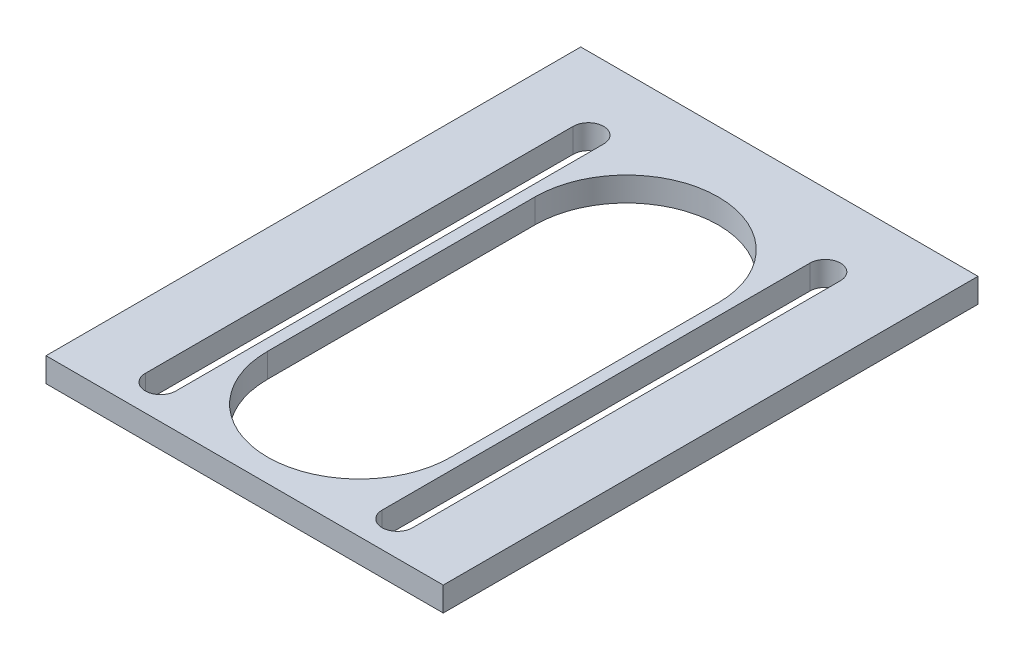
ISO-10303-21;
HEADER;
FILE_DESCRIPTION(('STEP AP214'),'2;1');
FILE_NAME('part.step','',(''),(''),'','','');
FILE_SCHEMA(('AUTOMOTIVE_DESIGN { 1 0 10303 214 1 1 1 1 }'));
ENDSEC;
DATA;
#1=APPLICATION_CONTEXT('core data for automotive mechanical design processes');
#2=APPLICATION_PROTOCOL_DEFINITION('international standard','automotive_design',2000,#1);
#3=PRODUCT_CONTEXT('',#1,'mechanical');
#4=PRODUCT('Part','Part','',(#3));
#5=PRODUCT_RELATED_PRODUCT_CATEGORY('part','',(#4));
#6=PRODUCT_DEFINITION_FORMATION('','',#4);
#7=PRODUCT_DEFINITION_CONTEXT('part definition',#1,'design');
#8=PRODUCT_DEFINITION('design','',#6,#7);
#9=PRODUCT_DEFINITION_SHAPE('','',#8);
#10=(LENGTH_UNIT() NAMED_UNIT(*) SI_UNIT(.MILLI.,.METRE.));
#11=(NAMED_UNIT(*) PLANE_ANGLE_UNIT() SI_UNIT($,.RADIAN.));
#12=(NAMED_UNIT(*) SI_UNIT($,.STERADIAN.) SOLID_ANGLE_UNIT());
#13=UNCERTAINTY_MEASURE_WITH_UNIT(LENGTH_MEASURE(1.E-05),#10,'distance_accuracy_value','');
#14=(GEOMETRIC_REPRESENTATION_CONTEXT(3) GLOBAL_UNCERTAINTY_ASSIGNED_CONTEXT((#13)) GLOBAL_UNIT_ASSIGNED_CONTEXT((#10,
#11,#12)) REPRESENTATION_CONTEXT('',''));
#15=CARTESIAN_POINT('',(0.,0.,0.));
#16=DIRECTION('',(0.,0.,1.));
#17=DIRECTION('',(1.,0.,0.));
#18=AXIS2_PLACEMENT_3D('',#15,#16,#17);
#19=CARTESIAN_POINT('',(0.,3.175,0.));
#20=DIRECTION('',(0.,1.,0.));
#21=DIRECTION('',(0.,0.,1.));
#22=AXIS2_PLACEMENT_3D('',#19,#20,#21);
#23=PLANE('',#22);
#24=DIRECTION('',(0.,0.,-1.));
#25=VECTOR('',#24,1.);
#26=CARTESIAN_POINT('',(26.,3.175,33.4551165878642));
#27=LINE('',#26,#25);
#28=CARTESIAN_POINT('',(26.,3.175,33.4551165878642));
#29=VERTEX_POINT('',#28);
#30=CARTESIAN_POINT('',(26.,3.175,-36.5448834121358));
#31=VERTEX_POINT('',#30);
#32=EDGE_CURVE('E315',#29,#31,#27,.T.);
#33=ORIENTED_EDGE('',*,*,#32,.T.);
#34=DIRECTION('',(-1.,0.,0.));
#35=VECTOR('',#34,1.);
#36=CARTESIAN_POINT('',(26.,3.175,-36.5448834121358));
#37=LINE('',#36,#35);
#38=CARTESIAN_POINT('',(-26.,3.175,-36.5448834121358));
#39=VERTEX_POINT('',#38);
#40=EDGE_CURVE('E318',#31,#39,#37,.T.);
#41=ORIENTED_EDGE('',*,*,#40,.T.);
#42=DIRECTION('',(0.,0.,1.));
#43=VECTOR('',#42,1.);
#44=CARTESIAN_POINT('',(-26.,3.175,-36.5448834121358));
#45=LINE('',#44,#43);
#46=CARTESIAN_POINT('',(-26.,3.175,33.4551165878642));
#47=VERTEX_POINT('',#46);
#48=EDGE_CURVE('E321',#39,#47,#45,.T.);
#49=ORIENTED_EDGE('',*,*,#48,.T.);
#50=DIRECTION('',(1.,0.,0.));
#51=VECTOR('',#50,1.);
#52=CARTESIAN_POINT('',(-26.,3.175,33.4551165878642));
#53=LINE('',#52,#51);
#54=EDGE_CURVE('E323',#47,#29,#53,.T.);
#55=ORIENTED_EDGE('',*,*,#54,.T.);
#56=EDGE_LOOP('',(#33,#41,#49,#55));
#57=FACE_BOUND('',#56,.T.);
#58=CARTESIAN_POINT('',(-15.5,3.175,28.9551165878641));
#59=DIRECTION('',(0.,1.,0.));
#60=DIRECTION('',(0.,0.,1.));
#61=AXIS2_PLACEMENT_3D('',#58,#59,#60);
#62=CIRCLE('',#61,2.);
#63=CARTESIAN_POINT('',(-17.5,3.175,28.9551165878641));
#64=VERTEX_POINT('',#63);
#65=CARTESIAN_POINT('',(-13.5,3.175,28.9551165878641));
#66=VERTEX_POINT('',#65);
#67=EDGE_CURVE('E286',#64,#66,#62,.T.);
#68=ORIENTED_EDGE('',*,*,#67,.F.);
#69=DIRECTION('',(0.,0.,1.));
#70=VECTOR('',#69,1.);
#71=CARTESIAN_POINT('',(-17.5,3.175,0.));
#72=LINE('',#71,#70);
#73=CARTESIAN_POINT('',(-17.5,3.175,-27.0448834121359));
#74=VERTEX_POINT('',#73);
#75=EDGE_CURVE('E284',#74,#64,#72,.T.);
#76=ORIENTED_EDGE('',*,*,#75,.F.);
#77=CARTESIAN_POINT('',(-15.5,3.175,-27.0448834121359));
#78=DIRECTION('',(0.,1.,0.));
#79=DIRECTION('',(0.,0.,1.));
#80=AXIS2_PLACEMENT_3D('',#77,#78,#79);
#81=CIRCLE('',#80,2.);
#82=CARTESIAN_POINT('',(-13.5,3.175,-27.0448834121359));
#83=VERTEX_POINT('',#82);
#84=EDGE_CURVE('E292',#83,#74,#81,.T.);
#85=ORIENTED_EDGE('',*,*,#84,.F.);
#86=DIRECTION('',(0.,0.,1.));
#87=VECTOR('',#86,1.);
#88=CARTESIAN_POINT('',(-13.5,3.175,0.));
#89=LINE('',#88,#87);
#90=EDGE_CURVE('E289',#83,#66,#89,.T.);
#91=ORIENTED_EDGE('',*,*,#90,.T.);
#92=EDGE_LOOP('',(#68,#76,#85,#91));
#93=FACE_BOUND('',#92,.T.);
#94=CARTESIAN_POINT('',(0.,3.175,18.4551165878641));
#95=DIRECTION('',(0.,1.,0.));
#96=DIRECTION('',(0.,0.,1.));
#97=AXIS2_PLACEMENT_3D('',#94,#95,#96);
#98=CIRCLE('',#97,12.);
#99=CARTESIAN_POINT('',(-12.,3.175,18.4551165878641));
#100=VERTEX_POINT('',#99);
#101=CARTESIAN_POINT('',(12.,3.175,18.4551165878641));
#102=VERTEX_POINT('',#101);
#103=EDGE_CURVE('E255',#100,#102,#98,.T.);
#104=ORIENTED_EDGE('',*,*,#103,.F.);
#105=DIRECTION('',(0.,0.,1.));
#106=VECTOR('',#105,1.);
#107=CARTESIAN_POINT('',(-12.,3.175,0.));
#108=LINE('',#107,#106);
#109=CARTESIAN_POINT('',(-12.,3.175,-16.5448834121359));
#110=VERTEX_POINT('',#109);
#111=EDGE_CURVE('E253',#110,#100,#108,.T.);
#112=ORIENTED_EDGE('',*,*,#111,.F.);
#113=CARTESIAN_POINT('',(0.,3.175,-16.5448834121359));
#114=DIRECTION('',(0.,1.,0.));
#115=DIRECTION('',(0.,0.,1.));
#116=AXIS2_PLACEMENT_3D('',#113,#114,#115);
#117=CIRCLE('',#116,12.);
#118=CARTESIAN_POINT('',(12.,3.175,-16.5448834121359));
#119=VERTEX_POINT('',#118);
#120=EDGE_CURVE('E261',#119,#110,#117,.T.);
#121=ORIENTED_EDGE('',*,*,#120,.F.);
#122=DIRECTION('',(0.,0.,1.));
#123=VECTOR('',#122,1.);
#124=CARTESIAN_POINT('',(12.,3.175,0.));
#125=LINE('',#124,#123);
#126=EDGE_CURVE('E258',#119,#102,#125,.T.);
#127=ORIENTED_EDGE('',*,*,#126,.T.);
#128=EDGE_LOOP('',(#104,#112,#121,#127));
#129=FACE_BOUND('',#128,.T.);
#130=CARTESIAN_POINT('',(15.5,3.175,28.9551165878641));
#131=DIRECTION('',(0.,1.,0.));
#132=DIRECTION('',(0.,0.,1.));
#133=AXIS2_PLACEMENT_3D('',#130,#131,#132);
#134=CIRCLE('',#133,1.99999999999997);
#135=CARTESIAN_POINT('',(13.5,3.175,28.9551165878641));
#136=VERTEX_POINT('',#135);
#137=CARTESIAN_POINT('',(17.5,3.175,28.9551165878641));
#138=VERTEX_POINT('',#137);
#139=EDGE_CURVE('E227',#136,#138,#134,.T.);
#140=ORIENTED_EDGE('',*,*,#139,.F.);
#141=DIRECTION('',(0.,0.,1.));
#142=VECTOR('',#141,1.);
#143=CARTESIAN_POINT('',(13.5,3.175,0.));
#144=LINE('',#143,#142);
#145=CARTESIAN_POINT('',(13.5,3.175,-27.0448834121359));
#146=VERTEX_POINT('',#145);
#147=EDGE_CURVE('E219',#146,#136,#144,.T.);
#148=ORIENTED_EDGE('',*,*,#147,.F.);
#149=CARTESIAN_POINT('',(15.5,3.175,-27.0448834121359));
#150=DIRECTION('',(0.,1.,0.));
#151=DIRECTION('',(0.,0.,1.));
#152=AXIS2_PLACEMENT_3D('',#149,#150,#151);
#153=CIRCLE('',#152,1.99999999999997);
#154=CARTESIAN_POINT('',(17.5,3.175,-27.0448834121359));
#155=VERTEX_POINT('',#154);
#156=EDGE_CURVE('E238',#155,#146,#153,.T.);
#157=ORIENTED_EDGE('',*,*,#156,.F.);
#158=DIRECTION('',(0.,0.,1.));
#159=VECTOR('',#158,1.);
#160=CARTESIAN_POINT('',(17.5,3.175,0.));
#161=LINE('',#160,#159);
#162=EDGE_CURVE('E120',#155,#138,#161,.T.);
#163=ORIENTED_EDGE('',*,*,#162,.T.);
#164=EDGE_LOOP('',(#140,#148,#157,#163));
#165=FACE_BOUND('',#164,.T.);
#166=ADVANCED_FACE('F105',(#57,#93,#129,#165),#23,.T.);
#167=CARTESIAN_POINT('',(0.,0.,0.));
#168=DIRECTION('',(0.,1.,0.));
#169=DIRECTION('',(0.,0.,1.));
#170=AXIS2_PLACEMENT_3D('',#167,#168,#169);
#171=PLANE('',#170);
#172=DIRECTION('',(0.,0.,1.));
#173=VECTOR('',#172,1.);
#174=CARTESIAN_POINT('',(-12.,0.,0.));
#175=LINE('',#174,#173);
#176=CARTESIAN_POINT('',(-12.,0.,-16.5448834121359));
#177=VERTEX_POINT('',#176);
#178=CARTESIAN_POINT('',(-12.,0.,18.4551165878641));
#179=VERTEX_POINT('',#178);
#180=EDGE_CURVE('E234',#177,#179,#175,.T.);
#181=ORIENTED_EDGE('',*,*,#180,.T.);
#182=CARTESIAN_POINT('',(0.,0.,18.4551165878641));
#183=DIRECTION('',(0.,1.,0.));
#184=DIRECTION('',(0.,0.,1.));
#185=AXIS2_PLACEMENT_3D('',#182,#183,#184);
#186=CIRCLE('',#185,12.);
#187=CARTESIAN_POINT('',(12.,0.,18.4551165878641));
#188=VERTEX_POINT('',#187);
#189=EDGE_CURVE('E266',#179,#188,#186,.T.);
#190=ORIENTED_EDGE('',*,*,#189,.T.);
#191=DIRECTION('',(0.,0.,1.));
#192=VECTOR('',#191,1.);
#193=CARTESIAN_POINT('',(12.,0.,0.));
#194=LINE('',#193,#192);
#195=CARTESIAN_POINT('',(12.,0.,-16.5448834121359));
#196=VERTEX_POINT('',#195);
#197=EDGE_CURVE('E269',#196,#188,#194,.T.);
#198=ORIENTED_EDGE('',*,*,#197,.F.);
#199=CARTESIAN_POINT('',(0.,0.,-16.5448834121359));
#200=DIRECTION('',(0.,1.,0.));
#201=DIRECTION('',(0.,0.,1.));
#202=AXIS2_PLACEMENT_3D('',#199,#200,#201);
#203=CIRCLE('',#202,12.);
#204=EDGE_CURVE('E256',#196,#177,#203,.T.);
#205=ORIENTED_EDGE('',*,*,#204,.T.);
#206=EDGE_LOOP('',(#181,#190,#198,#205));
#207=FACE_BOUND('',#206,.T.);
#208=DIRECTION('',(0.,0.,-1.));
#209=VECTOR('',#208,1.);
#210=CARTESIAN_POINT('',(26.,0.,33.4551165878642));
#211=LINE('',#210,#209);
#212=CARTESIAN_POINT('',(26.,0.,33.4551165878642));
#213=VERTEX_POINT('',#212);
#214=CARTESIAN_POINT('',(26.,0.,-36.5448834121358));
#215=VERTEX_POINT('',#214);
#216=EDGE_CURVE('E314',#213,#215,#211,.T.);
#217=ORIENTED_EDGE('',*,*,#216,.F.);
#218=DIRECTION('',(1.,0.,0.));
#219=VECTOR('',#218,1.);
#220=CARTESIAN_POINT('',(-26.,0.,33.4551165878642));
#221=LINE('',#220,#219);
#222=CARTESIAN_POINT('',(-26.,0.,33.4551165878642));
#223=VERTEX_POINT('',#222);
#224=EDGE_CURVE('E319',#223,#213,#221,.T.);
#225=ORIENTED_EDGE('',*,*,#224,.F.);
#226=DIRECTION('',(0.,0.,1.));
#227=VECTOR('',#226,1.);
#228=CARTESIAN_POINT('',(-26.,0.,-36.5448834121358));
#229=LINE('',#228,#227);
#230=CARTESIAN_POINT('',(-26.,0.,-36.5448834121358));
#231=VERTEX_POINT('',#230);
#232=EDGE_CURVE('E330',#231,#223,#229,.T.);
#233=ORIENTED_EDGE('',*,*,#232,.F.);
#234=DIRECTION('',(-1.,0.,0.));
#235=VECTOR('',#234,1.);
#236=CARTESIAN_POINT('',(26.,0.,-36.5448834121358));
#237=LINE('',#236,#235);
#238=EDGE_CURVE('E328',#215,#231,#237,.T.);
#239=ORIENTED_EDGE('',*,*,#238,.F.);
#240=EDGE_LOOP('',(#217,#225,#233,#239));
#241=FACE_BOUND('',#240,.T.);
#242=DIRECTION('',(0.,0.,1.));
#243=VECTOR('',#242,1.);
#244=CARTESIAN_POINT('',(-17.5,0.,0.));
#245=LINE('',#244,#243);
#246=CARTESIAN_POINT('',(-17.5,0.,-27.0448834121359));
#247=VERTEX_POINT('',#246);
#248=CARTESIAN_POINT('',(-17.5,0.,28.9551165878641));
#249=VERTEX_POINT('',#248);
#250=EDGE_CURVE('E283',#247,#249,#245,.T.);
#251=ORIENTED_EDGE('',*,*,#250,.T.);
#252=CARTESIAN_POINT('',(-15.5,0.,28.9551165878641));
#253=DIRECTION('',(0.,1.,0.));
#254=DIRECTION('',(0.,0.,1.));
#255=AXIS2_PLACEMENT_3D('',#252,#253,#254);
#256=CIRCLE('',#255,2.);
#257=CARTESIAN_POINT('',(-13.5,0.,28.9551165878641));
#258=VERTEX_POINT('',#257);
#259=EDGE_CURVE('E297',#249,#258,#256,.T.);
#260=ORIENTED_EDGE('',*,*,#259,.T.);
#261=DIRECTION('',(0.,0.,1.));
#262=VECTOR('',#261,1.);
#263=CARTESIAN_POINT('',(-13.5,0.,0.));
#264=LINE('',#263,#262);
#265=CARTESIAN_POINT('',(-13.5,0.,-27.0448834121359));
#266=VERTEX_POINT('',#265);
#267=EDGE_CURVE('E300',#266,#258,#264,.T.);
#268=ORIENTED_EDGE('',*,*,#267,.F.);
#269=CARTESIAN_POINT('',(-15.5,0.,-27.0448834121359));
#270=DIRECTION('',(0.,1.,0.));
#271=DIRECTION('',(0.,0.,1.));
#272=AXIS2_PLACEMENT_3D('',#269,#270,#271);
#273=CIRCLE('',#272,2.);
#274=EDGE_CURVE('E287',#266,#247,#273,.T.);
#275=ORIENTED_EDGE('',*,*,#274,.T.);
#276=EDGE_LOOP('',(#251,#260,#268,#275));
#277=FACE_BOUND('',#276,.T.);
#278=DIRECTION('',(0.,0.,1.));
#279=VECTOR('',#278,1.);
#280=CARTESIAN_POINT('',(13.5,0.,0.));
#281=LINE('',#280,#279);
#282=CARTESIAN_POINT('',(13.5,0.,-27.0448834121359));
#283=VERTEX_POINT('',#282);
#284=CARTESIAN_POINT('',(13.5,0.,28.9551165878641));
#285=VERTEX_POINT('',#284);
#286=EDGE_CURVE('E128',#283,#285,#281,.T.);
#287=ORIENTED_EDGE('',*,*,#286,.T.);
#288=CARTESIAN_POINT('',(15.5,0.,28.9551165878641));
#289=DIRECTION('',(0.,1.,0.));
#290=DIRECTION('',(0.,0.,1.));
#291=AXIS2_PLACEMENT_3D('',#288,#289,#290);
#292=CIRCLE('',#291,1.99999999999997);
#293=CARTESIAN_POINT('',(17.5,0.,28.9551165878641));
#294=VERTEX_POINT('',#293);
#295=EDGE_CURVE('E233',#285,#294,#292,.T.);
#296=ORIENTED_EDGE('',*,*,#295,.T.);
#297=DIRECTION('',(0.,0.,1.));
#298=VECTOR('',#297,1.);
#299=CARTESIAN_POINT('',(17.5,0.,0.));
#300=LINE('',#299,#298);
#301=CARTESIAN_POINT('',(17.5,0.,-27.0448834121359));
#302=VERTEX_POINT('',#301);
#303=EDGE_CURVE('E244',#302,#294,#300,.T.);
#304=ORIENTED_EDGE('',*,*,#303,.F.);
#305=CARTESIAN_POINT('',(15.5,0.,-27.0448834121359));
#306=DIRECTION('',(0.,1.,0.));
#307=DIRECTION('',(0.,0.,1.));
#308=AXIS2_PLACEMENT_3D('',#305,#306,#307);
#309=CIRCLE('',#308,1.99999999999997);
#310=EDGE_CURVE('E228',#302,#283,#309,.T.);
#311=ORIENTED_EDGE('',*,*,#310,.T.);
#312=EDGE_LOOP('',(#287,#296,#304,#311));
#313=FACE_BOUND('',#312,.T.);
#314=ADVANCED_FACE('F348',(#207,#241,#277,#313),#171,.F.);
#315=CARTESIAN_POINT('',(26.,3.175,33.4551165878642));
#316=DIRECTION('',(-1.,0.,0.));
#317=DIRECTION('',(0.,0.,1.));
#318=AXIS2_PLACEMENT_3D('',#315,#316,#317);
#319=PLANE('',#318);
#320=ORIENTED_EDGE('',*,*,#216,.T.);
#321=DIRECTION('',(0.,-1.,0.));
#322=VECTOR('',#321,1.);
#323=CARTESIAN_POINT('',(26.,3.175,-36.5448834121358));
#324=LINE('',#323,#322);
#325=EDGE_CURVE('E12',#31,#215,#324,.T.);
#326=ORIENTED_EDGE('',*,*,#325,.F.);
#327=ORIENTED_EDGE('',*,*,#32,.F.);
#328=DIRECTION('',(0.,-1.,0.));
#329=VECTOR('',#328,1.);
#330=CARTESIAN_POINT('',(26.,3.175,33.4551165878642));
#331=LINE('',#330,#329);
#332=EDGE_CURVE('E325',#29,#213,#331,.T.);
#333=ORIENTED_EDGE('',*,*,#332,.T.);
#334=EDGE_LOOP('',(#320,#326,#327,#333));
#335=FACE_BOUND('',#334,.T.);
#336=ADVANCED_FACE('F107',(#335),#319,.F.);
#337=CARTESIAN_POINT('',(26.,3.175,-36.5448834121358));
#338=DIRECTION('',(0.,0.,1.));
#339=DIRECTION('',(1.,0.,0.));
#340=AXIS2_PLACEMENT_3D('',#337,#338,#339);
#341=PLANE('',#340);
#342=ORIENTED_EDGE('',*,*,#238,.T.);
#343=DIRECTION('',(0.,-1.,0.));
#344=VECTOR('',#343,1.);
#345=CARTESIAN_POINT('',(-26.,3.175,-36.5448834121358));
#346=LINE('',#345,#344);
#347=EDGE_CURVE('E113',#39,#231,#346,.T.);
#348=ORIENTED_EDGE('',*,*,#347,.F.);
#349=ORIENTED_EDGE('',*,*,#40,.F.);
#350=ORIENTED_EDGE('',*,*,#325,.T.);
#351=EDGE_LOOP('',(#342,#348,#349,#350));
#352=FACE_BOUND('',#351,.T.);
#353=ADVANCED_FACE('F359',(#352),#341,.F.);
#354=CARTESIAN_POINT('',(-26.,3.175,-36.5448834121358));
#355=DIRECTION('',(1.,0.,0.));
#356=DIRECTION('',(0.,0.,-1.));
#357=AXIS2_PLACEMENT_3D('',#354,#355,#356);
#358=PLANE('',#357);
#359=ORIENTED_EDGE('',*,*,#232,.T.);
#360=DIRECTION('',(0.,-1.,0.));
#361=VECTOR('',#360,1.);
#362=CARTESIAN_POINT('',(-26.,3.175,33.4551165878642));
#363=LINE('',#362,#361);
#364=EDGE_CURVE('E335',#47,#223,#363,.T.);
#365=ORIENTED_EDGE('',*,*,#364,.F.);
#366=ORIENTED_EDGE('',*,*,#48,.F.);
#367=ORIENTED_EDGE('',*,*,#347,.T.);
#368=EDGE_LOOP('',(#359,#365,#366,#367));
#369=FACE_BOUND('',#368,.T.);
#370=ADVANCED_FACE('F342',(#369),#358,.F.);
#371=CARTESIAN_POINT('',(-26.,3.175,33.4551165878642));
#372=DIRECTION('',(0.,0.,-1.));
#373=DIRECTION('',(-1.,0.,0.));
#374=AXIS2_PLACEMENT_3D('',#371,#372,#373);
#375=PLANE('',#374);
#376=ORIENTED_EDGE('',*,*,#224,.T.);
#377=ORIENTED_EDGE('',*,*,#332,.F.);
#378=ORIENTED_EDGE('',*,*,#54,.F.);
#379=ORIENTED_EDGE('',*,*,#364,.T.);
#380=EDGE_LOOP('',(#376,#377,#378,#379));
#381=FACE_BOUND('',#380,.T.);
#382=ADVANCED_FACE('F352',(#381),#375,.F.);
#383=CARTESIAN_POINT('',(-17.5,3.175,0.));
#384=DIRECTION('',(1.,0.,0.));
#385=DIRECTION('',(0.,0.,-1.));
#386=AXIS2_PLACEMENT_3D('',#383,#384,#385);
#387=PLANE('',#386);
#388=ORIENTED_EDGE('',*,*,#250,.F.);
#389=DIRECTION('',(0.,-1.,0.));
#390=VECTOR('',#389,1.);
#391=CARTESIAN_POINT('',(-17.5,3.175,-27.0448834121359));
#392=LINE('',#391,#390);
#393=EDGE_CURVE('E294',#74,#247,#392,.T.);
#394=ORIENTED_EDGE('',*,*,#393,.F.);
#395=ORIENTED_EDGE('',*,*,#75,.T.);
#396=DIRECTION('',(0.,-1.,0.));
#397=VECTOR('',#396,1.);
#398=CARTESIAN_POINT('',(-17.5,3.175,28.9551165878641));
#399=LINE('',#398,#397);
#400=EDGE_CURVE('E311',#64,#249,#399,.T.);
#401=ORIENTED_EDGE('',*,*,#400,.T.);
#402=EDGE_LOOP('',(#388,#394,#395,#401));
#403=FACE_BOUND('',#402,.T.);
#404=ADVANCED_FACE('F374',(#403),#387,.T.);
#405=CARTESIAN_POINT('',(-15.5,3.175,28.9551165878641));
#406=DIRECTION('',(0.,-1.,0.));
#407=DIRECTION('',(0.,0.,-1.));
#408=AXIS2_PLACEMENT_3D('',#405,#406,#407);
#409=CYLINDRICAL_SURFACE('',#408,2.);
#410=ORIENTED_EDGE('',*,*,#259,.F.);
#411=ORIENTED_EDGE('',*,*,#400,.F.);
#412=ORIENTED_EDGE('',*,*,#67,.T.);
#413=DIRECTION('',(0.,-1.,0.));
#414=VECTOR('',#413,1.);
#415=CARTESIAN_POINT('',(-13.5,3.175,28.9551165878641));
#416=LINE('',#415,#414);
#417=EDGE_CURVE('E309',#66,#258,#416,.T.);
#418=ORIENTED_EDGE('',*,*,#417,.T.);
#419=EDGE_LOOP('',(#410,#411,#412,#418));
#420=FACE_BOUND('',#419,.T.);
#421=ADVANCED_FACE('F381',(#420),#409,.F.);
#422=CARTESIAN_POINT('',(-13.5,3.175,0.));
#423=DIRECTION('',(1.,0.,0.));
#424=DIRECTION('',(0.,0.,-1.));
#425=AXIS2_PLACEMENT_3D('',#422,#423,#424);
#426=PLANE('',#425);
#427=ORIENTED_EDGE('',*,*,#267,.T.);
#428=ORIENTED_EDGE('',*,*,#417,.F.);
#429=ORIENTED_EDGE('',*,*,#90,.F.);
#430=DIRECTION('',(0.,-1.,0.));
#431=VECTOR('',#430,1.);
#432=CARTESIAN_POINT('',(-13.5,3.175,-27.0448834121359));
#433=LINE('',#432,#431);
#434=EDGE_CURVE('E307',#83,#266,#433,.T.);
#435=ORIENTED_EDGE('',*,*,#434,.T.);
#436=EDGE_LOOP('',(#427,#428,#429,#435));
#437=FACE_BOUND('',#436,.T.);
#438=ADVANCED_FACE('F386',(#437),#426,.F.);
#439=CARTESIAN_POINT('',(-15.5,3.175,-27.0448834121359));
#440=DIRECTION('',(0.,-1.,0.));
#441=DIRECTION('',(0.,0.,-1.));
#442=AXIS2_PLACEMENT_3D('',#439,#440,#441);
#443=CYLINDRICAL_SURFACE('',#442,2.);
#444=ORIENTED_EDGE('',*,*,#274,.F.);
#445=ORIENTED_EDGE('',*,*,#434,.F.);
#446=ORIENTED_EDGE('',*,*,#84,.T.);
#447=ORIENTED_EDGE('',*,*,#393,.T.);
#448=EDGE_LOOP('',(#444,#445,#446,#447));
#449=FACE_BOUND('',#448,.T.);
#450=ADVANCED_FACE('F393',(#449),#443,.F.);
#451=CARTESIAN_POINT('',(-12.,3.175,0.));
#452=DIRECTION('',(1.,0.,0.));
#453=DIRECTION('',(0.,0.,-1.));
#454=AXIS2_PLACEMENT_3D('',#451,#452,#453);
#455=PLANE('',#454);
#456=ORIENTED_EDGE('',*,*,#180,.F.);
#457=DIRECTION('',(0.,-1.,0.));
#458=VECTOR('',#457,1.);
#459=CARTESIAN_POINT('',(-12.,3.175,-16.5448834121359));
#460=LINE('',#459,#458);
#461=EDGE_CURVE('E263',#110,#177,#460,.T.);
#462=ORIENTED_EDGE('',*,*,#461,.F.);
#463=ORIENTED_EDGE('',*,*,#111,.T.);
#464=DIRECTION('',(0.,-1.,0.));
#465=VECTOR('',#464,1.);
#466=CARTESIAN_POINT('',(-12.,3.175,18.4551165878641));
#467=LINE('',#466,#465);
#468=EDGE_CURVE('E280',#100,#179,#467,.T.);
#469=ORIENTED_EDGE('',*,*,#468,.T.);
#470=EDGE_LOOP('',(#456,#462,#463,#469));
#471=FACE_BOUND('',#470,.T.);
#472=ADVANCED_FACE('F415',(#471),#455,.T.);
#473=CARTESIAN_POINT('',(0.,3.175,18.4551165878641));
#474=DIRECTION('',(0.,-1.,0.));
#475=DIRECTION('',(0.,0.,-1.));
#476=AXIS2_PLACEMENT_3D('',#473,#474,#475);
#477=CYLINDRICAL_SURFACE('',#476,12.);
#478=ORIENTED_EDGE('',*,*,#189,.F.);
#479=ORIENTED_EDGE('',*,*,#468,.F.);
#480=ORIENTED_EDGE('',*,*,#103,.T.);
#481=DIRECTION('',(0.,-1.,0.));
#482=VECTOR('',#481,1.);
#483=CARTESIAN_POINT('',(12.,3.175,18.4551165878641));
#484=LINE('',#483,#482);
#485=EDGE_CURVE('E278',#102,#188,#484,.T.);
#486=ORIENTED_EDGE('',*,*,#485,.T.);
#487=EDGE_LOOP('',(#478,#479,#480,#486));
#488=FACE_BOUND('',#487,.T.);
#489=ADVANCED_FACE('F408',(#488),#477,.F.);
#490=CARTESIAN_POINT('',(12.,3.175,0.));
#491=DIRECTION('',(1.,0.,0.));
#492=DIRECTION('',(0.,0.,-1.));
#493=AXIS2_PLACEMENT_3D('',#490,#491,#492);
#494=PLANE('',#493);
#495=ORIENTED_EDGE('',*,*,#197,.T.);
#496=ORIENTED_EDGE('',*,*,#485,.F.);
#497=ORIENTED_EDGE('',*,*,#126,.F.);
#498=DIRECTION('',(0.,-1.,0.));
#499=VECTOR('',#498,1.);
#500=CARTESIAN_POINT('',(12.,3.175,-16.5448834121359));
#501=LINE('',#500,#499);
#502=EDGE_CURVE('E276',#119,#196,#501,.T.);
#503=ORIENTED_EDGE('',*,*,#502,.T.);
#504=EDGE_LOOP('',(#495,#496,#497,#503));
#505=FACE_BOUND('',#504,.T.);
#506=ADVANCED_FACE('F410',(#505),#494,.F.);
#507=CARTESIAN_POINT('',(0.,3.175,-16.5448834121359));
#508=DIRECTION('',(0.,-1.,0.));
#509=DIRECTION('',(0.,0.,-1.));
#510=AXIS2_PLACEMENT_3D('',#507,#508,#509);
#511=CYLINDRICAL_SURFACE('',#510,12.);
#512=ORIENTED_EDGE('',*,*,#204,.F.);
#513=ORIENTED_EDGE('',*,*,#502,.F.);
#514=ORIENTED_EDGE('',*,*,#120,.T.);
#515=ORIENTED_EDGE('',*,*,#461,.T.);
#516=EDGE_LOOP('',(#512,#513,#514,#515));
#517=FACE_BOUND('',#516,.T.);
#518=ADVANCED_FACE('F418',(#517),#511,.F.);
#519=CARTESIAN_POINT('',(13.5,3.175,0.));
#520=DIRECTION('',(1.,0.,0.));
#521=DIRECTION('',(0.,0.,-1.));
#522=AXIS2_PLACEMENT_3D('',#519,#520,#521);
#523=PLANE('',#522);
#524=ORIENTED_EDGE('',*,*,#286,.F.);
#525=DIRECTION('',(0.,-1.,0.));
#526=VECTOR('',#525,1.);
#527=CARTESIAN_POINT('',(13.5,3.175,-27.0448834121359));
#528=LINE('',#527,#526);
#529=EDGE_CURVE('E223',#146,#283,#528,.T.);
#530=ORIENTED_EDGE('',*,*,#529,.F.);
#531=ORIENTED_EDGE('',*,*,#147,.T.);
#532=DIRECTION('',(0.,-1.,0.));
#533=VECTOR('',#532,1.);
#534=CARTESIAN_POINT('',(13.5,3.175,28.9551165878641));
#535=LINE('',#534,#533);
#536=EDGE_CURVE('E222',#136,#285,#535,.T.);
#537=ORIENTED_EDGE('',*,*,#536,.T.);
#538=EDGE_LOOP('',(#524,#530,#531,#537));
#539=FACE_BOUND('',#538,.T.);
#540=ADVANCED_FACE('F221',(#539),#523,.T.);
#541=CARTESIAN_POINT('',(15.5,3.175,28.9551165878641));
#542=DIRECTION('',(0.,-1.,0.));
#543=DIRECTION('',(0.,0.,-1.));
#544=AXIS2_PLACEMENT_3D('',#541,#542,#543);
#545=CYLINDRICAL_SURFACE('',#544,1.99999999999997);
#546=ORIENTED_EDGE('',*,*,#295,.F.);
#547=ORIENTED_EDGE('',*,*,#536,.F.);
#548=ORIENTED_EDGE('',*,*,#139,.T.);
#549=DIRECTION('',(0.,-1.,0.));
#550=VECTOR('',#549,1.);
#551=CARTESIAN_POINT('',(17.5,3.175,28.9551165878641));
#552=LINE('',#551,#550);
#553=EDGE_CURVE('E235',#138,#294,#552,.T.);
#554=ORIENTED_EDGE('',*,*,#553,.T.);
#555=EDGE_LOOP('',(#546,#547,#548,#554));
#556=FACE_BOUND('',#555,.T.);
#557=ADVANCED_FACE('F231',(#556),#545,.F.);
#558=CARTESIAN_POINT('',(17.5,3.175,0.));
#559=DIRECTION('',(1.,0.,0.));
#560=DIRECTION('',(0.,0.,-1.));
#561=AXIS2_PLACEMENT_3D('',#558,#559,#560);
#562=PLANE('',#561);
#563=ORIENTED_EDGE('',*,*,#303,.T.);
#564=ORIENTED_EDGE('',*,*,#553,.F.);
#565=ORIENTED_EDGE('',*,*,#162,.F.);
#566=DIRECTION('',(0.,-1.,0.));
#567=VECTOR('',#566,1.);
#568=CARTESIAN_POINT('',(17.5,3.175,-27.0448834121359));
#569=LINE('',#568,#567);
#570=EDGE_CURVE('E250',#155,#302,#569,.T.);
#571=ORIENTED_EDGE('',*,*,#570,.T.);
#572=EDGE_LOOP('',(#563,#564,#565,#571));
#573=FACE_BOUND('',#572,.T.);
#574=ADVANCED_FACE('F477',(#573),#562,.F.);
#575=CARTESIAN_POINT('',(15.5,3.175,-27.0448834121359));
#576=DIRECTION('',(0.,-1.,0.));
#577=DIRECTION('',(0.,0.,-1.));
#578=AXIS2_PLACEMENT_3D('',#575,#576,#577);
#579=CYLINDRICAL_SURFACE('',#578,1.99999999999997);
#580=ORIENTED_EDGE('',*,*,#310,.F.);
#581=ORIENTED_EDGE('',*,*,#570,.F.);
#582=ORIENTED_EDGE('',*,*,#156,.T.);
#583=ORIENTED_EDGE('',*,*,#529,.T.);
#584=EDGE_LOOP('',(#580,#581,#582,#583));
#585=FACE_BOUND('',#584,.T.);
#586=ADVANCED_FACE('F485',(#585),#579,.F.);
#587=CLOSED_SHELL('',(#166,#314,#336,#353,#370,#382,#404,#421,#438,#450,#472,#489,#506,#518,
#540,#557,#574,#586));
#588=MANIFOLD_SOLID_BREP('B2',#587);
#589=ADVANCED_BREP_SHAPE_REPRESENTATION('',(#18,#588),#14);
#590=SHAPE_DEFINITION_REPRESENTATION(#9,#589);
ENDSEC;
END-ISO-10303-21;
